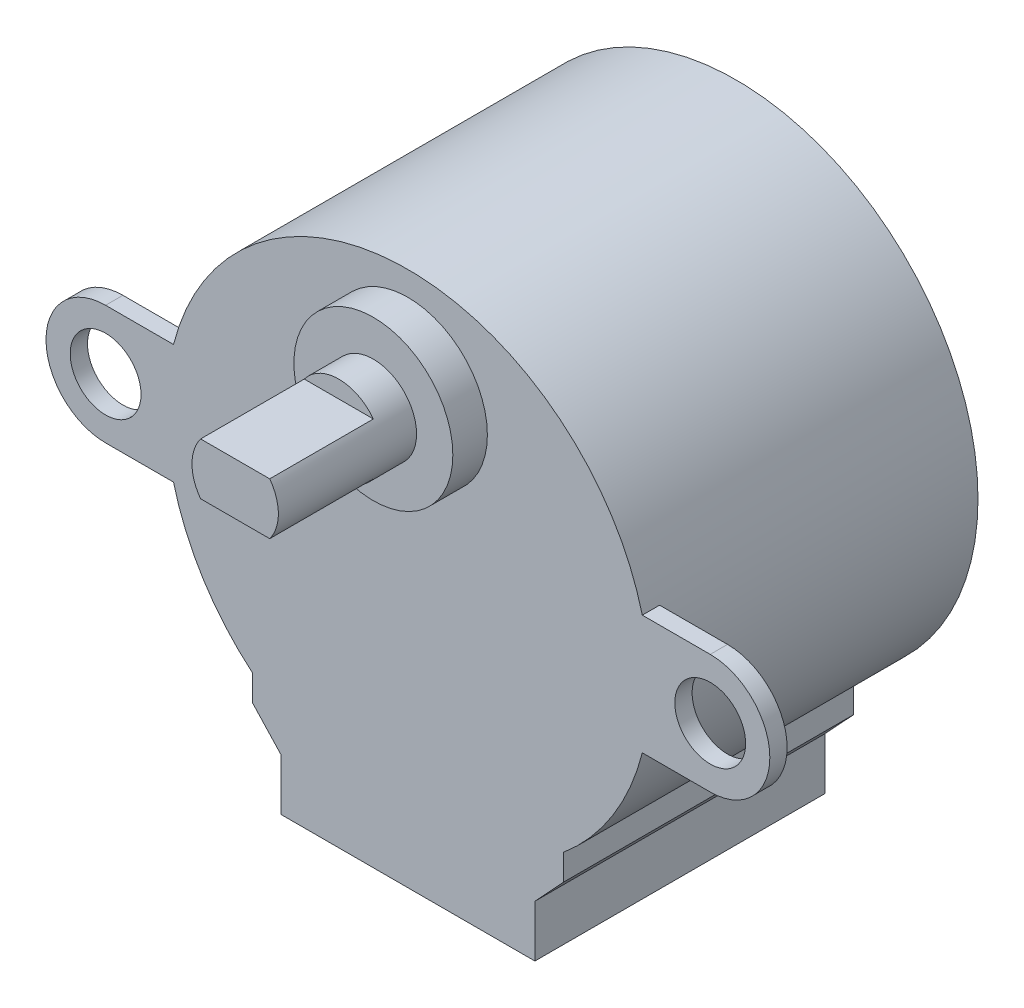
ISO-10303-21;
HEADER;
FILE_DESCRIPTION(('STEP AP214'),'2;1');
FILE_NAME('part.step','',(''),(''),'','','');
FILE_SCHEMA(('AUTOMOTIVE_DESIGN { 1 0 10303 214 1 1 1 1 }'));
ENDSEC;
DATA;
#1=APPLICATION_CONTEXT('core data for automotive mechanical design processes');
#2=APPLICATION_PROTOCOL_DEFINITION('international standard','automotive_design',2000,#1);
#3=PRODUCT_CONTEXT('',#1,'mechanical');
#4=PRODUCT('Part','Part','',(#3));
#5=PRODUCT_RELATED_PRODUCT_CATEGORY('part','',(#4));
#6=PRODUCT_DEFINITION_FORMATION('','',#4);
#7=PRODUCT_DEFINITION_CONTEXT('part definition',#1,'design');
#8=PRODUCT_DEFINITION('design','',#6,#7);
#9=PRODUCT_DEFINITION_SHAPE('','',#8);
#10=(LENGTH_UNIT() NAMED_UNIT(*) SI_UNIT(.MILLI.,.METRE.));
#11=(NAMED_UNIT(*) PLANE_ANGLE_UNIT() SI_UNIT($,.RADIAN.));
#12=(NAMED_UNIT(*) SI_UNIT($,.STERADIAN.) SOLID_ANGLE_UNIT());
#13=UNCERTAINTY_MEASURE_WITH_UNIT(LENGTH_MEASURE(1.E-05),#10,'distance_accuracy_value','');
#14=(GEOMETRIC_REPRESENTATION_CONTEXT(3) GLOBAL_UNCERTAINTY_ASSIGNED_CONTEXT((#13)) GLOBAL_UNIT_ASSIGNED_CONTEXT((#10,
#11,#12)) REPRESENTATION_CONTEXT('',''));
#15=CARTESIAN_POINT('',(0.,0.,0.));
#16=DIRECTION('',(0.,0.,1.));
#17=DIRECTION('',(1.,0.,0.));
#18=AXIS2_PLACEMENT_3D('',#15,#16,#17);
#19=CARTESIAN_POINT('',(0.,8.,29.));
#20=DIRECTION('',(0.,0.,-1.));
#21=DIRECTION('',(-1.,0.,0.));
#22=AXIS2_PLACEMENT_3D('',#19,#20,#21);
#23=CYLINDRICAL_SURFACE('',#22,2.5);
#24=CARTESIAN_POINT('',(0.,8.,29.));
#25=DIRECTION('',(0.,0.,1.));
#26=DIRECTION('',(1.,0.,0.));
#27=AXIS2_PLACEMENT_3D('',#24,#25,#26);
#28=CIRCLE('',#27,2.5);
#29=CARTESIAN_POINT('',(-2.,9.5,29.));
#30=VERTEX_POINT('',#29);
#31=CARTESIAN_POINT('',(-2.,6.5,29.));
#32=VERTEX_POINT('',#31);
#33=EDGE_CURVE('E219',#30,#32,#28,.T.);
#34=ORIENTED_EDGE('',*,*,#33,.F.);
#35=DIRECTION('',(0.,0.,1.));
#36=VECTOR('',#35,1.);
#37=CARTESIAN_POINT('',(-2.,9.5,23.));
#38=LINE('',#37,#36);
#39=CARTESIAN_POINT('',(-2.,9.5,23.));
#40=VERTEX_POINT('',#39);
#41=EDGE_CURVE('E66',#40,#30,#38,.T.);
#42=ORIENTED_EDGE('',*,*,#41,.F.);
#43=CARTESIAN_POINT('',(0.,8.,23.));
#44=DIRECTION('',(0.,0.,1.));
#45=DIRECTION('',(1.,0.,0.));
#46=AXIS2_PLACEMENT_3D('',#43,#44,#45);
#47=CIRCLE('',#46,2.5);
#48=CARTESIAN_POINT('',(2.,9.5,23.));
#49=VERTEX_POINT('',#48);
#50=EDGE_CURVE('E205',#49,#40,#47,.T.);
#51=ORIENTED_EDGE('',*,*,#50,.F.);
#52=DIRECTION('',(0.,0.,1.));
#53=VECTOR('',#52,1.);
#54=CARTESIAN_POINT('',(2.,9.5,23.));
#55=LINE('',#54,#53);
#56=CARTESIAN_POINT('',(2.,9.5,29.));
#57=VERTEX_POINT('',#56);
#58=EDGE_CURVE('E213',#49,#57,#55,.T.);
#59=ORIENTED_EDGE('',*,*,#58,.T.);
#60=CARTESIAN_POINT('',(2.,6.5,29.));
#61=VERTEX_POINT('',#60);
#62=EDGE_CURVE('E221',#61,#57,#28,.T.);
#63=ORIENTED_EDGE('',*,*,#62,.F.);
#64=DIRECTION('',(0.,0.,1.));
#65=VECTOR('',#64,1.);
#66=CARTESIAN_POINT('',(2.,6.5,23.));
#67=LINE('',#66,#65);
#68=CARTESIAN_POINT('',(2.,6.5,23.));
#69=VERTEX_POINT('',#68);
#70=EDGE_CURVE('E58',#69,#61,#67,.T.);
#71=ORIENTED_EDGE('',*,*,#70,.F.);
#72=CARTESIAN_POINT('',(0.,8.,23.));
#73=DIRECTION('',(0.,0.,1.));
#74=DIRECTION('',(1.,0.,0.));
#75=AXIS2_PLACEMENT_3D('',#72,#73,#74);
#76=CIRCLE('',#75,2.5);
#77=CARTESIAN_POINT('',(-2.,6.5,23.));
#78=VERTEX_POINT('',#77);
#79=EDGE_CURVE('E227',#78,#69,#76,.T.);
#80=ORIENTED_EDGE('',*,*,#79,.F.);
#81=DIRECTION('',(0.,0.,1.));
#82=VECTOR('',#81,1.);
#83=CARTESIAN_POINT('',(-2.,6.5,23.));
#84=LINE('',#83,#82);
#85=EDGE_CURVE('E231',#78,#32,#84,.T.);
#86=ORIENTED_EDGE('',*,*,#85,.T.);
#87=EDGE_LOOP('',(#34,#42,#51,#59,#63,#71,#80,#86));
#88=FACE_BOUND('',#87,.T.);
#89=CARTESIAN_POINT('',(0.,8.,21.));
#90=DIRECTION('',(0.,0.,1.));
#91=DIRECTION('',(1.,0.,0.));
#92=AXIS2_PLACEMENT_3D('',#89,#90,#91);
#93=CIRCLE('',#92,2.5);
#94=CARTESIAN_POINT('',(2.5,8.,21.));
#95=VERTEX_POINT('',#94);
#96=EDGE_CURVE('E11',#95,#95,#93,.T.);
#97=ORIENTED_EDGE('',*,*,#96,.T.);
#98=EDGE_LOOP('',(#97));
#99=FACE_BOUND('',#98,.T.);
#100=ADVANCED_FACE('F41',(#88,#99),#23,.T.);
#101=CARTESIAN_POINT('',(0.,8.,29.));
#102=DIRECTION('',(0.,0.,1.));
#103=DIRECTION('',(1.,0.,0.));
#104=AXIS2_PLACEMENT_3D('',#101,#102,#103);
#105=PLANE('',#104);
#106=DIRECTION('',(1.,0.,0.));
#107=VECTOR('',#106,1.);
#108=CARTESIAN_POINT('',(0.,9.5,29.));
#109=LINE('',#108,#107);
#110=EDGE_CURVE('E210',#30,#57,#109,.T.);
#111=ORIENTED_EDGE('',*,*,#110,.F.);
#112=ORIENTED_EDGE('',*,*,#33,.T.);
#113=DIRECTION('',(1.,0.,0.));
#114=VECTOR('',#113,1.);
#115=CARTESIAN_POINT('',(0.,6.5,29.));
#116=LINE('',#115,#114);
#117=EDGE_CURVE('E228',#32,#61,#116,.T.);
#118=ORIENTED_EDGE('',*,*,#117,.T.);
#119=ORIENTED_EDGE('',*,*,#62,.T.);
#120=EDGE_LOOP('',(#111,#112,#118,#119));
#121=FACE_BOUND('',#120,.T.);
#122=ADVANCED_FACE('F429',(#121),#105,.T.);
#123=CARTESIAN_POINT('',(0.,0.,19.));
#124=DIRECTION('',(0.,0.,-1.));
#125=DIRECTION('',(-1.,0.,0.));
#126=AXIS2_PLACEMENT_3D('',#123,#124,#125);
#127=CYLINDRICAL_SURFACE('',#126,14.);
#128=CARTESIAN_POINT('',(0.,0.,19.));
#129=DIRECTION('',(0.,0.,1.));
#130=DIRECTION('',(1.,0.,0.));
#131=AXIS2_PLACEMENT_3D('',#128,#129,#130);
#132=CIRCLE('',#131,14.);
#133=CARTESIAN_POINT('',(13.5682533879641,3.45,19.));
#134=VERTEX_POINT('',#133);
#135=CARTESIAN_POINT('',(-13.5682533879641,3.45,19.));
#136=VERTEX_POINT('',#135);
#137=EDGE_CURVE('E405',#134,#136,#132,.T.);
#138=ORIENTED_EDGE('',*,*,#137,.F.);
#139=DIRECTION('',(0.,0.,1.));
#140=VECTOR('',#139,1.);
#141=CARTESIAN_POINT('',(13.5682533879641,3.45,18.));
#142=LINE('',#141,#140);
#143=CARTESIAN_POINT('',(13.5682533879641,3.45,18.));
#144=VERTEX_POINT('',#143);
#145=EDGE_CURVE('E240',#144,#134,#142,.T.);
#146=ORIENTED_EDGE('',*,*,#145,.F.);
#147=CARTESIAN_POINT('',(0.,0.,18.));
#148=DIRECTION('',(0.,0.,-1.));
#149=DIRECTION('',(-1.,0.,0.));
#150=AXIS2_PLACEMENT_3D('',#147,#148,#149);
#151=CIRCLE('',#150,14.);
#152=CARTESIAN_POINT('',(13.5682533879641,-3.45,18.));
#153=VERTEX_POINT('',#152);
#154=EDGE_CURVE('E257',#144,#153,#151,.T.);
#155=ORIENTED_EDGE('',*,*,#154,.T.);
#156=DIRECTION('',(0.,0.,1.));
#157=VECTOR('',#156,1.);
#158=CARTESIAN_POINT('',(13.5682533879641,-3.45,18.));
#159=LINE('',#158,#157);
#160=CARTESIAN_POINT('',(13.5682533879641,-3.45,19.));
#161=VERTEX_POINT('',#160);
#162=EDGE_CURVE('E244',#153,#161,#159,.T.);
#163=ORIENTED_EDGE('',*,*,#162,.T.);
#164=CARTESIAN_POINT('',(9.,-10.7238052947636,19.));
#165=VERTEX_POINT('',#164);
#166=EDGE_CURVE('E50',#165,#161,#132,.T.);
#167=ORIENTED_EDGE('',*,*,#166,.F.);
#168=DIRECTION('',(0.,0.,1.));
#169=VECTOR('',#168,1.);
#170=CARTESIAN_POINT('',(9.,-10.7238052947636,2.2));
#171=LINE('',#170,#169);
#172=CARTESIAN_POINT('',(9.,-10.7238052947636,2.2));
#173=VERTEX_POINT('',#172);
#174=EDGE_CURVE('E397',#173,#165,#171,.T.);
#175=ORIENTED_EDGE('',*,*,#174,.F.);
#176=CARTESIAN_POINT('',(0.,0.,2.2));
#177=DIRECTION('',(0.,0.,1.));
#178=DIRECTION('',(1.,0.,0.));
#179=AXIS2_PLACEMENT_3D('',#176,#177,#178);
#180=CIRCLE('',#179,14.);
#181=CARTESIAN_POINT('',(-8.99999999999999,-10.7238052947636,2.2));
#182=VERTEX_POINT('',#181);
#183=EDGE_CURVE('E361',#182,#173,#180,.T.);
#184=ORIENTED_EDGE('',*,*,#183,.F.);
#185=DIRECTION('',(0.,0.,1.));
#186=VECTOR('',#185,1.);
#187=CARTESIAN_POINT('',(-8.99999999999999,-10.7238052947636,2.2));
#188=LINE('',#187,#186);
#189=CARTESIAN_POINT('',(-8.99999999999999,-10.7238052947636,19.));
#190=VERTEX_POINT('',#189);
#191=EDGE_CURVE('E394',#182,#190,#188,.T.);
#192=ORIENTED_EDGE('',*,*,#191,.T.);
#193=CARTESIAN_POINT('',(-13.5682533879641,-3.45,19.));
#194=VERTEX_POINT('',#193);
#195=EDGE_CURVE('E406',#194,#190,#132,.T.);
#196=ORIENTED_EDGE('',*,*,#195,.F.);
#197=DIRECTION('',(0.,0.,1.));
#198=VECTOR('',#197,1.);
#199=CARTESIAN_POINT('',(-13.5682533879641,-3.45,18.));
#200=LINE('',#199,#198);
#201=CARTESIAN_POINT('',(-13.5682533879641,-3.45,18.));
#202=VERTEX_POINT('',#201);
#203=EDGE_CURVE('E312',#202,#194,#200,.T.);
#204=ORIENTED_EDGE('',*,*,#203,.F.);
#205=CARTESIAN_POINT('',(0.,0.,18.));
#206=DIRECTION('',(0.,0.,-1.));
#207=DIRECTION('',(1.,0.,0.));
#208=AXIS2_PLACEMENT_3D('',#205,#206,#207);
#209=CIRCLE('',#208,14.);
#210=CARTESIAN_POINT('',(-13.5682533879641,3.45,18.));
#211=VERTEX_POINT('',#210);
#212=EDGE_CURVE('E293',#202,#211,#209,.T.);
#213=ORIENTED_EDGE('',*,*,#212,.T.);
#214=DIRECTION('',(0.,0.,1.));
#215=VECTOR('',#214,1.);
#216=CARTESIAN_POINT('',(-13.5682533879641,3.45,18.));
#217=LINE('',#216,#215);
#218=EDGE_CURVE('E309',#211,#136,#217,.T.);
#219=ORIENTED_EDGE('',*,*,#218,.T.);
#220=EDGE_LOOP('',(#138,#146,#155,#163,#167,#175,#184,#192,#196,#204,#213,#219));
#221=FACE_BOUND('',#220,.T.);
#222=CARTESIAN_POINT('',(0.,0.,0.));
#223=DIRECTION('',(0.,0.,1.));
#224=DIRECTION('',(1.,0.,0.));
#225=AXIS2_PLACEMENT_3D('',#222,#223,#224);
#226=CIRCLE('',#225,14.);
#227=CARTESIAN_POINT('',(14.,0.,0.));
#228=VERTEX_POINT('',#227);
#229=EDGE_CURVE('E45',#228,#228,#226,.T.);
#230=ORIENTED_EDGE('',*,*,#229,.T.);
#231=EDGE_LOOP('',(#230));
#232=FACE_BOUND('',#231,.T.);
#233=ADVANCED_FACE('F43',(#221,#232),#127,.T.);
#234=CARTESIAN_POINT('',(0.,0.,19.));
#235=DIRECTION('',(0.,0.,1.));
#236=DIRECTION('',(1.,0.,0.));
#237=AXIS2_PLACEMENT_3D('',#234,#235,#236);
#238=PLANE('',#237);
#239=CARTESIAN_POINT('',(0.,8.,19.));
#240=DIRECTION('',(0.,0.,1.));
#241=DIRECTION('',(1.,0.,0.));
#242=AXIS2_PLACEMENT_3D('',#239,#240,#241);
#243=CIRCLE('',#242,4.6);
#244=CARTESIAN_POINT('',(4.6,8.,19.));
#245=VERTEX_POINT('',#244);
#246=EDGE_CURVE('E241',#245,#245,#243,.T.);
#247=ORIENTED_EDGE('',*,*,#246,.F.);
#248=EDGE_LOOP('',(#247));
#249=FACE_BOUND('',#248,.T.);
#250=ORIENTED_EDGE('',*,*,#166,.T.);
#251=DIRECTION('',(1.,0.,0.));
#252=VECTOR('',#251,1.);
#253=CARTESIAN_POINT('',(17.5,-3.45,19.));
#254=LINE('',#253,#252);
#255=CARTESIAN_POINT('',(17.5,-3.45,19.));
#256=VERTEX_POINT('',#255);
#257=EDGE_CURVE('E260',#161,#256,#254,.T.);
#258=ORIENTED_EDGE('',*,*,#257,.T.);
#259=CARTESIAN_POINT('',(17.5,0.,19.));
#260=DIRECTION('',(0.,0.,1.));
#261=DIRECTION('',(-1.,0.,0.));
#262=AXIS2_PLACEMENT_3D('',#259,#260,#261);
#263=CIRCLE('',#262,3.45);
#264=CARTESIAN_POINT('',(17.5,3.45,19.));
#265=VERTEX_POINT('',#264);
#266=EDGE_CURVE('E256',#256,#265,#263,.T.);
#267=ORIENTED_EDGE('',*,*,#266,.T.);
#268=DIRECTION('',(-1.,0.,0.));
#269=VECTOR('',#268,1.);
#270=CARTESIAN_POINT('',(17.5,3.45,19.));
#271=LINE('',#270,#269);
#272=EDGE_CURVE('E254',#265,#134,#271,.T.);
#273=ORIENTED_EDGE('',*,*,#272,.T.);
#274=ORIENTED_EDGE('',*,*,#137,.T.);
#275=DIRECTION('',(-1.,0.,0.));
#276=VECTOR('',#275,1.);
#277=CARTESIAN_POINT('',(-17.5,3.45,19.));
#278=LINE('',#277,#276);
#279=CARTESIAN_POINT('',(-17.5,3.45,19.));
#280=VERTEX_POINT('',#279);
#281=EDGE_CURVE('E290',#136,#280,#278,.T.);
#282=ORIENTED_EDGE('',*,*,#281,.T.);
#283=CARTESIAN_POINT('',(-17.5,0.,19.));
#284=DIRECTION('',(0.,0.,1.));
#285=DIRECTION('',(1.,0.,0.));
#286=AXIS2_PLACEMENT_3D('',#283,#284,#285);
#287=CIRCLE('',#286,3.45);
#288=CARTESIAN_POINT('',(-17.5,-3.45,19.));
#289=VERTEX_POINT('',#288);
#290=EDGE_CURVE('E283',#280,#289,#287,.T.);
#291=ORIENTED_EDGE('',*,*,#290,.T.);
#292=DIRECTION('',(1.,0.,0.));
#293=VECTOR('',#292,1.);
#294=CARTESIAN_POINT('',(-17.5,-3.45,19.));
#295=LINE('',#294,#293);
#296=EDGE_CURVE('E302',#289,#194,#295,.T.);
#297=ORIENTED_EDGE('',*,*,#296,.T.);
#298=ORIENTED_EDGE('',*,*,#195,.T.);
#299=DIRECTION('',(0.,1.,0.));
#300=VECTOR('',#299,1.);
#301=CARTESIAN_POINT('',(-9.,-12.2238052947636,19.));
#302=LINE('',#301,#300);
#303=CARTESIAN_POINT('',(-9.,-12.2238052947636,19.));
#304=VERTEX_POINT('',#303);
#305=EDGE_CURVE('E380',#304,#190,#302,.T.);
#306=ORIENTED_EDGE('',*,*,#305,.F.);
#307=DIRECTION('',(-0.68060089492241,0.732654367236567,0.));
#308=VECTOR('',#307,1.);
#309=CARTESIAN_POINT('',(-7.35,-14.,19.));
#310=LINE('',#309,#308);
#311=CARTESIAN_POINT('',(-7.35,-14.,19.));
#312=VERTEX_POINT('',#311);
#313=EDGE_CURVE('E383',#312,#304,#310,.T.);
#314=ORIENTED_EDGE('',*,*,#313,.F.);
#315=DIRECTION('',(0.,1.,0.));
#316=VECTOR('',#315,1.);
#317=CARTESIAN_POINT('',(-7.35,-17.,19.));
#318=LINE('',#317,#316);
#319=CARTESIAN_POINT('',(-7.35,-17.,19.));
#320=VERTEX_POINT('',#319);
#321=EDGE_CURVE('E352',#320,#312,#318,.T.);
#322=ORIENTED_EDGE('',*,*,#321,.F.);
#323=DIRECTION('',(1.,0.,0.));
#324=VECTOR('',#323,1.);
#325=CARTESIAN_POINT('',(-7.35,-17.,19.));
#326=LINE('',#325,#324);
#327=CARTESIAN_POINT('',(7.35,-17.,19.));
#328=VERTEX_POINT('',#327);
#329=EDGE_CURVE('E341',#320,#328,#326,.T.);
#330=ORIENTED_EDGE('',*,*,#329,.T.);
#331=DIRECTION('',(0.,1.,0.));
#332=VECTOR('',#331,1.);
#333=CARTESIAN_POINT('',(7.35,-17.,19.));
#334=LINE('',#333,#332);
#335=CARTESIAN_POINT('',(7.35,-14.,19.));
#336=VERTEX_POINT('',#335);
#337=EDGE_CURVE('E372',#328,#336,#334,.T.);
#338=ORIENTED_EDGE('',*,*,#337,.T.);
#339=DIRECTION('',(0.68060089492241,0.732654367236567,0.));
#340=VECTOR('',#339,1.);
#341=CARTESIAN_POINT('',(7.35,-14.,19.));
#342=LINE('',#341,#340);
#343=CARTESIAN_POINT('',(9.,-12.2238052947636,19.));
#344=VERTEX_POINT('',#343);
#345=EDGE_CURVE('E375',#336,#344,#342,.T.);
#346=ORIENTED_EDGE('',*,*,#345,.T.);
#347=DIRECTION('',(0.,1.,0.));
#348=VECTOR('',#347,1.);
#349=CARTESIAN_POINT('',(9.,-12.2238052947636,19.));
#350=LINE('',#349,#348);
#351=EDGE_CURVE('E378',#344,#165,#350,.T.);
#352=ORIENTED_EDGE('',*,*,#351,.T.);
#353=EDGE_LOOP('',(#250,#258,#267,#273,#274,#282,#291,#297,#298,#306,#314,#322,#330,#338,#346,#352));
#354=FACE_BOUND('',#353,.T.);
#355=CARTESIAN_POINT('',(-17.5,0.,19.));
#356=DIRECTION('',(0.,0.,1.));
#357=DIRECTION('',(1.,0.,0.));
#358=AXIS2_PLACEMENT_3D('',#355,#356,#357);
#359=CIRCLE('',#358,2.05);
#360=CARTESIAN_POINT('',(-15.45,0.,19.));
#361=VERTEX_POINT('',#360);
#362=EDGE_CURVE('E277',#361,#361,#359,.T.);
#363=ORIENTED_EDGE('',*,*,#362,.F.);
#364=EDGE_LOOP('',(#363));
#365=FACE_BOUND('',#364,.T.);
#366=CARTESIAN_POINT('',(17.5,0.,19.));
#367=DIRECTION('',(0.,0.,1.));
#368=DIRECTION('',(-1.,0.,0.));
#369=AXIS2_PLACEMENT_3D('',#366,#367,#368);
#370=CIRCLE('',#369,2.05);
#371=CARTESIAN_POINT('',(15.45,0.,19.));
#372=VERTEX_POINT('',#371);
#373=EDGE_CURVE('E274',#372,#372,#370,.T.);
#374=ORIENTED_EDGE('',*,*,#373,.F.);
#375=EDGE_LOOP('',(#374));
#376=FACE_BOUND('',#375,.T.);
#377=ADVANCED_FACE('F418',(#249,#354,#365,#376),#238,.T.);
#378=CARTESIAN_POINT('',(0.,0.,0.));
#379=DIRECTION('',(0.,0.,1.));
#380=DIRECTION('',(1.,0.,0.));
#381=AXIS2_PLACEMENT_3D('',#378,#379,#380);
#382=PLANE('',#381);
#383=ORIENTED_EDGE('',*,*,#229,.F.);
#384=EDGE_LOOP('',(#383));
#385=FACE_BOUND('',#384,.T.);
#386=ADVANCED_FACE('F415',(#385),#382,.F.);
#387=CARTESIAN_POINT('',(-7.35,-17.,2.2));
#388=DIRECTION('',(0.,-1.,0.));
#389=DIRECTION('',(0.,0.,-1.));
#390=AXIS2_PLACEMENT_3D('',#387,#388,#389);
#391=PLANE('',#390);
#392=CARTESIAN_POINT('',(-3.,-17.,17.25));
#393=DIRECTION('',(0.,-1.,0.));
#394=DIRECTION('',(0.,0.,-1.));
#395=AXIS2_PLACEMENT_3D('',#392,#393,#394);
#396=CIRCLE('',#395,0.499999999999997);
#397=CARTESIAN_POINT('',(-3.,-17.,17.75));
#398=VERTEX_POINT('',#397);
#399=CARTESIAN_POINT('',(-3.,-17.,16.75));
#400=VERTEX_POINT('',#399);
#401=EDGE_CURVE('E308',#398,#400,#396,.T.);
#402=ORIENTED_EDGE('',*,*,#401,.F.);
#403=DIRECTION('',(-1.,0.,0.));
#404=VECTOR('',#403,1.);
#405=CARTESIAN_POINT('',(-3.,-17.,17.75));
#406=LINE('',#405,#404);
#407=CARTESIAN_POINT('',(3.,-17.,17.75));
#408=VERTEX_POINT('',#407);
#409=EDGE_CURVE('E320',#408,#398,#406,.T.);
#410=ORIENTED_EDGE('',*,*,#409,.F.);
#411=CARTESIAN_POINT('',(3.,-17.,17.25));
#412=DIRECTION('',(0.,-1.,0.));
#413=DIRECTION('',(0.,0.,-1.));
#414=AXIS2_PLACEMENT_3D('',#411,#412,#413);
#415=CIRCLE('',#414,0.499999999999997);
#416=CARTESIAN_POINT('',(3.,-17.,16.75));
#417=VERTEX_POINT('',#416);
#418=EDGE_CURVE('E334',#417,#408,#415,.T.);
#419=ORIENTED_EDGE('',*,*,#418,.F.);
#420=DIRECTION('',(1.,0.,0.));
#421=VECTOR('',#420,1.);
#422=CARTESIAN_POINT('',(-3.,-17.,16.75));
#423=LINE('',#422,#421);
#424=EDGE_CURVE('E331',#400,#417,#423,.T.);
#425=ORIENTED_EDGE('',*,*,#424,.F.);
#426=EDGE_LOOP('',(#402,#410,#419,#425));
#427=FACE_BOUND('',#426,.T.);
#428=ORIENTED_EDGE('',*,*,#329,.F.);
#429=DIRECTION('',(0.,0.,1.));
#430=VECTOR('',#429,1.);
#431=CARTESIAN_POINT('',(-7.35,-17.,2.2));
#432=LINE('',#431,#430);
#433=CARTESIAN_POINT('',(-7.35,-17.,2.2));
#434=VERTEX_POINT('',#433);
#435=EDGE_CURVE('E386',#434,#320,#432,.T.);
#436=ORIENTED_EDGE('',*,*,#435,.F.);
#437=DIRECTION('',(1.,0.,0.));
#438=VECTOR('',#437,1.);
#439=CARTESIAN_POINT('',(-7.35,-17.,2.2));
#440=LINE('',#439,#438);
#441=CARTESIAN_POINT('',(7.35,-17.,2.2));
#442=VERTEX_POINT('',#441);
#443=EDGE_CURVE('E348',#434,#442,#440,.T.);
#444=ORIENTED_EDGE('',*,*,#443,.T.);
#445=DIRECTION('',(0.,0.,1.));
#446=VECTOR('',#445,1.);
#447=CARTESIAN_POINT('',(7.35,-17.,2.2));
#448=LINE('',#447,#446);
#449=EDGE_CURVE('E369',#442,#328,#448,.T.);
#450=ORIENTED_EDGE('',*,*,#449,.T.);
#451=EDGE_LOOP('',(#428,#436,#444,#450));
#452=FACE_BOUND('',#451,.T.);
#453=ADVANCED_FACE('F417',(#427,#452),#391,.T.);
#454=CARTESIAN_POINT('',(-7.35,-17.,2.2));
#455=DIRECTION('',(1.,0.,0.));
#456=DIRECTION('',(0.,0.,-1.));
#457=AXIS2_PLACEMENT_3D('',#454,#455,#456);
#458=PLANE('',#457);
#459=ORIENTED_EDGE('',*,*,#321,.T.);
#460=DIRECTION('',(0.,0.,1.));
#461=VECTOR('',#460,1.);
#462=CARTESIAN_POINT('',(-7.35,-14.,2.2));
#463=LINE('',#462,#461);
#464=CARTESIAN_POINT('',(-7.35,-14.,2.2));
#465=VERTEX_POINT('',#464);
#466=EDGE_CURVE('E388',#465,#312,#463,.T.);
#467=ORIENTED_EDGE('',*,*,#466,.F.);
#468=DIRECTION('',(0.,1.,0.));
#469=VECTOR('',#468,1.);
#470=CARTESIAN_POINT('',(-7.35,-17.,2.2));
#471=LINE('',#470,#469);
#472=EDGE_CURVE('E367',#434,#465,#471,.T.);
#473=ORIENTED_EDGE('',*,*,#472,.F.);
#474=ORIENTED_EDGE('',*,*,#435,.T.);
#475=EDGE_LOOP('',(#459,#467,#473,#474));
#476=FACE_BOUND('',#475,.T.);
#477=ADVANCED_FACE('F423',(#476),#458,.F.);
#478=CARTESIAN_POINT('',(-7.35,-14.,2.2));
#479=DIRECTION('',(0.732654367236567,0.68060089492241,0.));
#480=DIRECTION('',(-0.68060089492241,0.732654367236567,0.));
#481=AXIS2_PLACEMENT_3D('',#478,#479,#480);
#482=PLANE('',#481);
#483=ORIENTED_EDGE('',*,*,#313,.T.);
#484=DIRECTION('',(0.,0.,1.));
#485=VECTOR('',#484,1.);
#486=CARTESIAN_POINT('',(-9.,-12.2238052947636,2.2));
#487=LINE('',#486,#485);
#488=CARTESIAN_POINT('',(-9.,-12.2238052947636,2.2));
#489=VERTEX_POINT('',#488);
#490=EDGE_CURVE('E391',#489,#304,#487,.T.);
#491=ORIENTED_EDGE('',*,*,#490,.F.);
#492=DIRECTION('',(-0.68060089492241,0.732654367236567,0.));
#493=VECTOR('',#492,1.);
#494=CARTESIAN_POINT('',(-7.35,-14.,2.2));
#495=LINE('',#494,#493);
#496=EDGE_CURVE('E365',#465,#489,#495,.T.);
#497=ORIENTED_EDGE('',*,*,#496,.F.);
#498=ORIENTED_EDGE('',*,*,#466,.T.);
#499=EDGE_LOOP('',(#483,#491,#497,#498));
#500=FACE_BOUND('',#499,.T.);
#501=ADVANCED_FACE('F514',(#500),#482,.F.);
#502=CARTESIAN_POINT('',(-9.,-12.2238052947636,2.2));
#503=DIRECTION('',(1.,0.,0.));
#504=DIRECTION('',(0.,0.,-1.));
#505=AXIS2_PLACEMENT_3D('',#502,#503,#504);
#506=PLANE('',#505);
#507=ORIENTED_EDGE('',*,*,#305,.T.);
#508=ORIENTED_EDGE('',*,*,#191,.F.);
#509=DIRECTION('',(0.,1.,0.));
#510=VECTOR('',#509,1.);
#511=CARTESIAN_POINT('',(-9.,-12.2238052947636,2.2));
#512=LINE('',#511,#510);
#513=EDGE_CURVE('E363',#489,#182,#512,.T.);
#514=ORIENTED_EDGE('',*,*,#513,.F.);
#515=ORIENTED_EDGE('',*,*,#490,.T.);
#516=EDGE_LOOP('',(#507,#508,#514,#515));
#517=FACE_BOUND('',#516,.T.);
#518=ADVANCED_FACE('F518',(#517),#506,.F.);
#519=CARTESIAN_POINT('',(9.,-12.2238052947636,2.2));
#520=DIRECTION('',(1.,0.,0.));
#521=DIRECTION('',(0.,0.,-1.));
#522=AXIS2_PLACEMENT_3D('',#519,#520,#521);
#523=PLANE('',#522);
#524=ORIENTED_EDGE('',*,*,#351,.F.);
#525=DIRECTION('',(0.,0.,1.));
#526=VECTOR('',#525,1.);
#527=CARTESIAN_POINT('',(9.,-12.2238052947636,2.2));
#528=LINE('',#527,#526);
#529=CARTESIAN_POINT('',(9.,-12.2238052947636,2.2));
#530=VERTEX_POINT('',#529);
#531=EDGE_CURVE('E400',#530,#344,#528,.T.);
#532=ORIENTED_EDGE('',*,*,#531,.F.);
#533=DIRECTION('',(0.,1.,0.));
#534=VECTOR('',#533,1.);
#535=CARTESIAN_POINT('',(9.,-12.2238052947636,2.2));
#536=LINE('',#535,#534);
#537=EDGE_CURVE('E358',#530,#173,#536,.T.);
#538=ORIENTED_EDGE('',*,*,#537,.T.);
#539=ORIENTED_EDGE('',*,*,#174,.T.);
#540=EDGE_LOOP('',(#524,#532,#538,#539));
#541=FACE_BOUND('',#540,.T.);
#542=ADVANCED_FACE('F522',(#541),#523,.T.);
#543=CARTESIAN_POINT('',(7.35,-14.,2.2));
#544=DIRECTION('',(0.732654367236567,-0.68060089492241,0.));
#545=DIRECTION('',(0.68060089492241,0.732654367236567,0.));
#546=AXIS2_PLACEMENT_3D('',#543,#544,#545);
#547=PLANE('',#546);
#548=ORIENTED_EDGE('',*,*,#345,.F.);
#549=DIRECTION('',(0.,0.,1.));
#550=VECTOR('',#549,1.);
#551=CARTESIAN_POINT('',(7.35,-14.,2.2));
#552=LINE('',#551,#550);
#553=CARTESIAN_POINT('',(7.35,-14.,2.2));
#554=VERTEX_POINT('',#553);
#555=EDGE_CURVE('E402',#554,#336,#552,.T.);
#556=ORIENTED_EDGE('',*,*,#555,.F.);
#557=DIRECTION('',(0.68060089492241,0.732654367236567,0.));
#558=VECTOR('',#557,1.);
#559=CARTESIAN_POINT('',(7.35,-14.,2.2));
#560=LINE('',#559,#558);
#561=EDGE_CURVE('E355',#554,#530,#560,.T.);
#562=ORIENTED_EDGE('',*,*,#561,.T.);
#563=ORIENTED_EDGE('',*,*,#531,.T.);
#564=EDGE_LOOP('',(#548,#556,#562,#563));
#565=FACE_BOUND('',#564,.T.);
#566=ADVANCED_FACE('F526',(#565),#547,.T.);
#567=CARTESIAN_POINT('',(7.35,-17.,2.2));
#568=DIRECTION('',(1.,0.,0.));
#569=DIRECTION('',(0.,0.,-1.));
#570=AXIS2_PLACEMENT_3D('',#567,#568,#569);
#571=PLANE('',#570);
#572=ORIENTED_EDGE('',*,*,#337,.F.);
#573=ORIENTED_EDGE('',*,*,#449,.F.);
#574=DIRECTION('',(0.,1.,0.));
#575=VECTOR('',#574,1.);
#576=CARTESIAN_POINT('',(7.35,-17.,2.2));
#577=LINE('',#576,#575);
#578=EDGE_CURVE('E351',#442,#554,#577,.T.);
#579=ORIENTED_EDGE('',*,*,#578,.T.);
#580=ORIENTED_EDGE('',*,*,#555,.T.);
#581=EDGE_LOOP('',(#572,#573,#579,#580));
#582=FACE_BOUND('',#581,.T.);
#583=ADVANCED_FACE('F510',(#582),#571,.T.);
#584=CARTESIAN_POINT('',(0.,0.,2.2));
#585=DIRECTION('',(0.,0.,1.));
#586=DIRECTION('',(1.,0.,0.));
#587=AXIS2_PLACEMENT_3D('',#584,#585,#586);
#588=PLANE('',#587);
#589=ORIENTED_EDGE('',*,*,#443,.F.);
#590=ORIENTED_EDGE('',*,*,#472,.T.);
#591=ORIENTED_EDGE('',*,*,#496,.T.);
#592=ORIENTED_EDGE('',*,*,#513,.T.);
#593=ORIENTED_EDGE('',*,*,#183,.T.);
#594=ORIENTED_EDGE('',*,*,#537,.F.);
#595=ORIENTED_EDGE('',*,*,#561,.F.);
#596=ORIENTED_EDGE('',*,*,#578,.F.);
#597=EDGE_LOOP('',(#589,#590,#591,#592,#593,#594,#595,#596));
#598=FACE_BOUND('',#597,.T.);
#599=ADVANCED_FACE('F506',(#598),#588,.F.);
#600=CARTESIAN_POINT('',(-3.,-15.,17.25));
#601=DIRECTION('',(0.,-1.,0.));
#602=DIRECTION('',(0.,0.,-1.));
#603=AXIS2_PLACEMENT_3D('',#600,#601,#602);
#604=CYLINDRICAL_SURFACE('',#603,0.499999999999997);
#605=ORIENTED_EDGE('',*,*,#401,.T.);
#606=DIRECTION('',(0.,-1.,0.));
#607=VECTOR('',#606,1.);
#608=CARTESIAN_POINT('',(-3.,-15.,16.75));
#609=LINE('',#608,#607);
#610=CARTESIAN_POINT('',(-3.,-15.,16.75));
#611=VERTEX_POINT('',#610);
#612=EDGE_CURVE('E329',#611,#400,#609,.T.);
#613=ORIENTED_EDGE('',*,*,#612,.F.);
#614=CARTESIAN_POINT('',(-3.,-15.,17.25));
#615=DIRECTION('',(0.,-1.,0.));
#616=DIRECTION('',(0.,0.,-1.));
#617=AXIS2_PLACEMENT_3D('',#614,#615,#616);
#618=CIRCLE('',#617,0.499999999999997);
#619=CARTESIAN_POINT('',(-3.,-15.,17.75));
#620=VERTEX_POINT('',#619);
#621=EDGE_CURVE('E316',#620,#611,#618,.T.);
#622=ORIENTED_EDGE('',*,*,#621,.F.);
#623=DIRECTION('',(0.,-1.,0.));
#624=VECTOR('',#623,1.);
#625=CARTESIAN_POINT('',(-3.,-15.,17.75));
#626=LINE('',#625,#624);
#627=EDGE_CURVE('E339',#620,#398,#626,.T.);
#628=ORIENTED_EDGE('',*,*,#627,.T.);
#629=EDGE_LOOP('',(#605,#613,#622,#628));
#630=FACE_BOUND('',#629,.T.);
#631=ADVANCED_FACE('F496',(#630),#604,.F.);
#632=CARTESIAN_POINT('',(-3.,-15.,17.75));
#633=DIRECTION('',(0.,0.,1.));
#634=DIRECTION('',(1.,0.,0.));
#635=AXIS2_PLACEMENT_3D('',#632,#633,#634);
#636=PLANE('',#635);
#637=ORIENTED_EDGE('',*,*,#409,.T.);
#638=ORIENTED_EDGE('',*,*,#627,.F.);
#639=DIRECTION('',(-1.,0.,0.));
#640=VECTOR('',#639,1.);
#641=CARTESIAN_POINT('',(-3.,-15.,17.75));
#642=LINE('',#641,#640);
#643=CARTESIAN_POINT('',(3.,-15.,17.75));
#644=VERTEX_POINT('',#643);
#645=EDGE_CURVE('E326',#644,#620,#642,.T.);
#646=ORIENTED_EDGE('',*,*,#645,.F.);
#647=DIRECTION('',(0.,-1.,0.));
#648=VECTOR('',#647,1.);
#649=CARTESIAN_POINT('',(3.,-15.,17.75));
#650=LINE('',#649,#648);
#651=EDGE_CURVE('E342',#644,#408,#650,.T.);
#652=ORIENTED_EDGE('',*,*,#651,.T.);
#653=EDGE_LOOP('',(#637,#638,#646,#652));
#654=FACE_BOUND('',#653,.T.);
#655=ADVANCED_FACE('F492',(#654),#636,.F.);
#656=CARTESIAN_POINT('',(3.,-15.,17.25));
#657=DIRECTION('',(0.,-1.,0.));
#658=DIRECTION('',(0.,0.,-1.));
#659=AXIS2_PLACEMENT_3D('',#656,#657,#658);
#660=CYLINDRICAL_SURFACE('',#659,0.499999999999997);
#661=ORIENTED_EDGE('',*,*,#418,.T.);
#662=ORIENTED_EDGE('',*,*,#651,.F.);
#663=CARTESIAN_POINT('',(3.,-15.,17.25));
#664=DIRECTION('',(0.,-1.,0.));
#665=DIRECTION('',(0.,0.,-1.));
#666=AXIS2_PLACEMENT_3D('',#663,#664,#665);
#667=CIRCLE('',#666,0.499999999999997);
#668=CARTESIAN_POINT('',(3.,-15.,16.75));
#669=VERTEX_POINT('',#668);
#670=EDGE_CURVE('E323',#669,#644,#667,.T.);
#671=ORIENTED_EDGE('',*,*,#670,.F.);
#672=DIRECTION('',(0.,-1.,0.));
#673=VECTOR('',#672,1.);
#674=CARTESIAN_POINT('',(3.,-15.,16.75));
#675=LINE('',#674,#673);
#676=EDGE_CURVE('E344',#669,#417,#675,.T.);
#677=ORIENTED_EDGE('',*,*,#676,.T.);
#678=EDGE_LOOP('',(#661,#662,#671,#677));
#679=FACE_BOUND('',#678,.T.);
#680=ADVANCED_FACE('F495',(#679),#660,.F.);
#681=CARTESIAN_POINT('',(-3.,-15.,16.75));
#682=DIRECTION('',(0.,0.,-1.));
#683=DIRECTION('',(-1.,0.,0.));
#684=AXIS2_PLACEMENT_3D('',#681,#682,#683);
#685=PLANE('',#684);
#686=ORIENTED_EDGE('',*,*,#424,.T.);
#687=ORIENTED_EDGE('',*,*,#676,.F.);
#688=DIRECTION('',(1.,0.,0.));
#689=VECTOR('',#688,1.);
#690=CARTESIAN_POINT('',(-3.,-15.,16.75));
#691=LINE('',#690,#689);
#692=EDGE_CURVE('E319',#611,#669,#691,.T.);
#693=ORIENTED_EDGE('',*,*,#692,.F.);
#694=ORIENTED_EDGE('',*,*,#612,.T.);
#695=EDGE_LOOP('',(#686,#687,#693,#694));
#696=FACE_BOUND('',#695,.T.);
#697=ADVANCED_FACE('F490',(#696),#685,.F.);
#698=CARTESIAN_POINT('',(-3.,-15.,17.25));
#699=DIRECTION('',(0.,-1.,0.));
#700=DIRECTION('',(0.,0.,-1.));
#701=AXIS2_PLACEMENT_3D('',#698,#699,#700);
#702=PLANE('',#701);
#703=ORIENTED_EDGE('',*,*,#621,.T.);
#704=ORIENTED_EDGE('',*,*,#692,.T.);
#705=ORIENTED_EDGE('',*,*,#670,.T.);
#706=ORIENTED_EDGE('',*,*,#645,.T.);
#707=EDGE_LOOP('',(#703,#704,#705,#706));
#708=FACE_BOUND('',#707,.T.);
#709=ADVANCED_FACE('F486',(#708),#702,.T.);
#710=CARTESIAN_POINT('',(-17.5,0.,18.));
#711=DIRECTION('',(0.,0.,1.));
#712=DIRECTION('',(1.,0.,0.));
#713=AXIS2_PLACEMENT_3D('',#710,#711,#712);
#714=CYLINDRICAL_SURFACE('',#713,3.45);
#715=ORIENTED_EDGE('',*,*,#290,.F.);
#716=DIRECTION('',(0.,0.,1.));
#717=VECTOR('',#716,1.);
#718=CARTESIAN_POINT('',(-17.5,3.45,18.));
#719=LINE('',#718,#717);
#720=CARTESIAN_POINT('',(-17.5,3.45,18.));
#721=VERTEX_POINT('',#720);
#722=EDGE_CURVE('E306',#721,#280,#719,.T.);
#723=ORIENTED_EDGE('',*,*,#722,.F.);
#724=CARTESIAN_POINT('',(-17.5,0.,18.));
#725=DIRECTION('',(0.,0.,1.));
#726=DIRECTION('',(1.,0.,0.));
#727=AXIS2_PLACEMENT_3D('',#724,#725,#726);
#728=CIRCLE('',#727,3.45);
#729=CARTESIAN_POINT('',(-17.5,-3.45,18.));
#730=VERTEX_POINT('',#729);
#731=EDGE_CURVE('E286',#721,#730,#728,.T.);
#732=ORIENTED_EDGE('',*,*,#731,.T.);
#733=DIRECTION('',(0.,0.,1.));
#734=VECTOR('',#733,1.);
#735=CARTESIAN_POINT('',(-17.5,-3.45,18.));
#736=LINE('',#735,#734);
#737=EDGE_CURVE('E299',#730,#289,#736,.T.);
#738=ORIENTED_EDGE('',*,*,#737,.T.);
#739=EDGE_LOOP('',(#715,#723,#732,#738));
#740=FACE_BOUND('',#739,.T.);
#741=ADVANCED_FACE('F479',(#740),#714,.T.);
#742=CARTESIAN_POINT('',(-17.5,3.45,18.));
#743=DIRECTION('',(0.,1.,0.));
#744=DIRECTION('',(0.,0.,1.));
#745=AXIS2_PLACEMENT_3D('',#742,#743,#744);
#746=PLANE('',#745);
#747=ORIENTED_EDGE('',*,*,#281,.F.);
#748=ORIENTED_EDGE('',*,*,#218,.F.);
#749=DIRECTION('',(-1.,0.,0.));
#750=VECTOR('',#749,1.);
#751=CARTESIAN_POINT('',(-17.5,3.45,18.));
#752=LINE('',#751,#750);
#753=EDGE_CURVE('E296',#211,#721,#752,.T.);
#754=ORIENTED_EDGE('',*,*,#753,.T.);
#755=ORIENTED_EDGE('',*,*,#722,.T.);
#756=EDGE_LOOP('',(#747,#748,#754,#755));
#757=FACE_BOUND('',#756,.T.);
#758=ADVANCED_FACE('F476',(#757),#746,.T.);
#759=CARTESIAN_POINT('',(-17.5,-3.45,18.));
#760=DIRECTION('',(0.,-1.,0.));
#761=DIRECTION('',(0.,0.,-1.));
#762=AXIS2_PLACEMENT_3D('',#759,#760,#761);
#763=PLANE('',#762);
#764=ORIENTED_EDGE('',*,*,#296,.F.);
#765=ORIENTED_EDGE('',*,*,#737,.F.);
#766=DIRECTION('',(1.,0.,0.));
#767=VECTOR('',#766,1.);
#768=CARTESIAN_POINT('',(-17.5,-3.45,18.));
#769=LINE('',#768,#767);
#770=EDGE_CURVE('E289',#730,#202,#769,.T.);
#771=ORIENTED_EDGE('',*,*,#770,.T.);
#772=ORIENTED_EDGE('',*,*,#203,.T.);
#773=EDGE_LOOP('',(#764,#765,#771,#772));
#774=FACE_BOUND('',#773,.T.);
#775=ADVANCED_FACE('F474',(#774),#763,.T.);
#776=CARTESIAN_POINT('',(-17.5,0.,18.));
#777=DIRECTION('',(0.,0.,1.));
#778=DIRECTION('',(1.,0.,0.));
#779=AXIS2_PLACEMENT_3D('',#776,#777,#778);
#780=PLANE('',#779);
#781=CARTESIAN_POINT('',(-17.5,0.,18.));
#782=DIRECTION('',(0.,0.,1.));
#783=DIRECTION('',(1.,0.,0.));
#784=AXIS2_PLACEMENT_3D('',#781,#782,#783);
#785=CIRCLE('',#784,2.05);
#786=CARTESIAN_POINT('',(-15.45,0.,18.));
#787=VERTEX_POINT('',#786);
#788=EDGE_CURVE('E280',#787,#787,#785,.T.);
#789=ORIENTED_EDGE('',*,*,#788,.T.);
#790=EDGE_LOOP('',(#789));
#791=FACE_BOUND('',#790,.T.);
#792=ORIENTED_EDGE('',*,*,#731,.F.);
#793=ORIENTED_EDGE('',*,*,#753,.F.);
#794=ORIENTED_EDGE('',*,*,#212,.F.);
#795=ORIENTED_EDGE('',*,*,#770,.F.);
#796=EDGE_LOOP('',(#792,#793,#794,#795));
#797=FACE_BOUND('',#796,.T.);
#798=ADVANCED_FACE('F470',(#791,#797),#780,.F.);
#799=CARTESIAN_POINT('',(-17.5,0.,18.));
#800=DIRECTION('',(0.,0.,1.));
#801=DIRECTION('',(1.,0.,0.));
#802=AXIS2_PLACEMENT_3D('',#799,#800,#801);
#803=CYLINDRICAL_SURFACE('',#802,2.05);
#804=ORIENTED_EDGE('',*,*,#788,.F.);
#805=EDGE_LOOP('',(#804));
#806=FACE_BOUND('',#805,.T.);
#807=ORIENTED_EDGE('',*,*,#362,.T.);
#808=EDGE_LOOP('',(#807));
#809=FACE_BOUND('',#808,.T.);
#810=ADVANCED_FACE('F460',(#806,#809),#803,.F.);
#811=CARTESIAN_POINT('',(17.5,3.45,18.));
#812=DIRECTION('',(0.,1.,0.));
#813=DIRECTION('',(0.,0.,1.));
#814=AXIS2_PLACEMENT_3D('',#811,#812,#813);
#815=PLANE('',#814);
#816=ORIENTED_EDGE('',*,*,#272,.F.);
#817=DIRECTION('',(0.,0.,1.));
#818=VECTOR('',#817,1.);
#819=CARTESIAN_POINT('',(17.5,3.45,18.));
#820=LINE('',#819,#818);
#821=CARTESIAN_POINT('',(17.5,3.45,18.));
#822=VERTEX_POINT('',#821);
#823=EDGE_CURVE('E250',#822,#265,#820,.T.);
#824=ORIENTED_EDGE('',*,*,#823,.F.);
#825=DIRECTION('',(-1.,0.,0.));
#826=VECTOR('',#825,1.);
#827=CARTESIAN_POINT('',(17.5,3.45,18.));
#828=LINE('',#827,#826);
#829=EDGE_CURVE('E247',#822,#144,#828,.T.);
#830=ORIENTED_EDGE('',*,*,#829,.T.);
#831=ORIENTED_EDGE('',*,*,#145,.T.);
#832=EDGE_LOOP('',(#816,#824,#830,#831));
#833=FACE_BOUND('',#832,.T.);
#834=ADVANCED_FACE('F456',(#833),#815,.T.);
#835=CARTESIAN_POINT('',(17.5,0.,18.));
#836=DIRECTION('',(0.,0.,1.));
#837=DIRECTION('',(1.,0.,0.));
#838=AXIS2_PLACEMENT_3D('',#835,#836,#837);
#839=CYLINDRICAL_SURFACE('',#838,3.45);
#840=ORIENTED_EDGE('',*,*,#266,.F.);
#841=DIRECTION('',(0.,0.,1.));
#842=VECTOR('',#841,1.);
#843=CARTESIAN_POINT('',(17.5,-3.45,18.));
#844=LINE('',#843,#842);
#845=CARTESIAN_POINT('',(17.5,-3.45,18.));
#846=VERTEX_POINT('',#845);
#847=EDGE_CURVE('E248',#846,#256,#844,.T.);
#848=ORIENTED_EDGE('',*,*,#847,.F.);
#849=CARTESIAN_POINT('',(17.5,0.,18.));
#850=DIRECTION('',(0.,0.,1.));
#851=DIRECTION('',(-1.,0.,0.));
#852=AXIS2_PLACEMENT_3D('',#849,#850,#851);
#853=CIRCLE('',#852,3.45);
#854=EDGE_CURVE('E266',#846,#822,#853,.T.);
#855=ORIENTED_EDGE('',*,*,#854,.T.);
#856=ORIENTED_EDGE('',*,*,#823,.T.);
#857=EDGE_LOOP('',(#840,#848,#855,#856));
#858=FACE_BOUND('',#857,.T.);
#859=ADVANCED_FACE('F452',(#858),#839,.T.);
#860=CARTESIAN_POINT('',(17.5,-3.45,18.));
#861=DIRECTION('',(0.,-1.,0.));
#862=DIRECTION('',(0.,0.,-1.));
#863=AXIS2_PLACEMENT_3D('',#860,#861,#862);
#864=PLANE('',#863);
#865=ORIENTED_EDGE('',*,*,#257,.F.);
#866=ORIENTED_EDGE('',*,*,#162,.F.);
#867=DIRECTION('',(1.,0.,0.));
#868=VECTOR('',#867,1.);
#869=CARTESIAN_POINT('',(17.5,-3.45,18.));
#870=LINE('',#869,#868);
#871=EDGE_CURVE('E269',#153,#846,#870,.T.);
#872=ORIENTED_EDGE('',*,*,#871,.T.);
#873=ORIENTED_EDGE('',*,*,#847,.T.);
#874=EDGE_LOOP('',(#865,#866,#872,#873));
#875=FACE_BOUND('',#874,.T.);
#876=ADVANCED_FACE('F448',(#875),#864,.T.);
#877=CARTESIAN_POINT('',(0.,0.,18.));
#878=DIRECTION('',(0.,0.,-1.));
#879=DIRECTION('',(-1.,0.,0.));
#880=AXIS2_PLACEMENT_3D('',#877,#878,#879);
#881=PLANE('',#880);
#882=CARTESIAN_POINT('',(17.5,0.,18.));
#883=DIRECTION('',(0.,0.,1.));
#884=DIRECTION('',(-1.,0.,0.));
#885=AXIS2_PLACEMENT_3D('',#882,#883,#884);
#886=CIRCLE('',#885,2.05);
#887=CARTESIAN_POINT('',(15.45,0.,18.));
#888=VERTEX_POINT('',#887);
#889=EDGE_CURVE('E263',#888,#888,#886,.T.);
#890=ORIENTED_EDGE('',*,*,#889,.T.);
#891=EDGE_LOOP('',(#890));
#892=FACE_BOUND('',#891,.T.);
#893=ORIENTED_EDGE('',*,*,#154,.F.);
#894=ORIENTED_EDGE('',*,*,#829,.F.);
#895=ORIENTED_EDGE('',*,*,#854,.F.);
#896=ORIENTED_EDGE('',*,*,#871,.F.);
#897=EDGE_LOOP('',(#893,#894,#895,#896));
#898=FACE_BOUND('',#897,.T.);
#899=ADVANCED_FACE('F451',(#892,#898),#881,.T.);
#900=CARTESIAN_POINT('',(17.5,0.,18.));
#901=DIRECTION('',(0.,0.,1.));
#902=DIRECTION('',(1.,0.,0.));
#903=AXIS2_PLACEMENT_3D('',#900,#901,#902);
#904=CYLINDRICAL_SURFACE('',#903,2.05);
#905=ORIENTED_EDGE('',*,*,#889,.F.);
#906=EDGE_LOOP('',(#905));
#907=FACE_BOUND('',#906,.T.);
#908=ORIENTED_EDGE('',*,*,#373,.T.);
#909=EDGE_LOOP('',(#908));
#910=FACE_BOUND('',#909,.T.);
#911=ADVANCED_FACE('F446',(#907,#910),#904,.F.);
#912=CARTESIAN_POINT('',(0.,8.,21.));
#913=DIRECTION('',(0.,0.,-1.));
#914=DIRECTION('',(-1.,0.,0.));
#915=AXIS2_PLACEMENT_3D('',#912,#913,#914);
#916=CYLINDRICAL_SURFACE('',#915,4.6);
#917=CARTESIAN_POINT('',(0.,8.,21.));
#918=DIRECTION('',(0.,0.,1.));
#919=DIRECTION('',(1.,0.,0.));
#920=AXIS2_PLACEMENT_3D('',#917,#918,#919);
#921=CIRCLE('',#920,4.6);
#922=CARTESIAN_POINT('',(4.6,8.,21.));
#923=VERTEX_POINT('',#922);
#924=EDGE_CURVE('E237',#923,#923,#921,.T.);
#925=ORIENTED_EDGE('',*,*,#924,.F.);
#926=EDGE_LOOP('',(#925));
#927=FACE_BOUND('',#926,.T.);
#928=ORIENTED_EDGE('',*,*,#246,.T.);
#929=EDGE_LOOP('',(#928));
#930=FACE_BOUND('',#929,.T.);
#931=ADVANCED_FACE('F442',(#927,#930),#916,.T.);
#932=CARTESIAN_POINT('',(0.,8.,21.));
#933=DIRECTION('',(0.,0.,1.));
#934=DIRECTION('',(1.,0.,0.));
#935=AXIS2_PLACEMENT_3D('',#932,#933,#934);
#936=PLANE('',#935);
#937=ORIENTED_EDGE('',*,*,#96,.F.);
#938=EDGE_LOOP('',(#937));
#939=FACE_BOUND('',#938,.T.);
#940=ORIENTED_EDGE('',*,*,#924,.T.);
#941=EDGE_LOOP('',(#940));
#942=FACE_BOUND('',#941,.T.);
#943=ADVANCED_FACE('F438',(#939,#942),#936,.T.);
#944=CARTESIAN_POINT('',(0.,6.5,23.));
#945=DIRECTION('',(0.,-1.,0.));
#946=DIRECTION('',(0.,0.,-1.));
#947=AXIS2_PLACEMENT_3D('',#944,#945,#946);
#948=PLANE('',#947);
#949=ORIENTED_EDGE('',*,*,#117,.F.);
#950=ORIENTED_EDGE('',*,*,#85,.F.);
#951=DIRECTION('',(1.,0.,0.));
#952=VECTOR('',#951,1.);
#953=CARTESIAN_POINT('',(0.,6.5,23.));
#954=LINE('',#953,#952);
#955=EDGE_CURVE('E225',#78,#69,#954,.T.);
#956=ORIENTED_EDGE('',*,*,#955,.T.);
#957=ORIENTED_EDGE('',*,*,#70,.T.);
#958=EDGE_LOOP('',(#949,#950,#956,#957));
#959=FACE_BOUND('',#958,.T.);
#960=ADVANCED_FACE('F441',(#959),#948,.T.);
#961=CARTESIAN_POINT('',(0.,0.,23.));
#962=DIRECTION('',(0.,0.,1.));
#963=DIRECTION('',(1.,0.,0.));
#964=AXIS2_PLACEMENT_3D('',#961,#962,#963);
#965=PLANE('',#964);
#966=ORIENTED_EDGE('',*,*,#955,.F.);
#967=ORIENTED_EDGE('',*,*,#79,.T.);
#968=EDGE_LOOP('',(#966,#967));
#969=FACE_BOUND('',#968,.T.);
#970=ADVANCED_FACE('F621',(#969),#965,.T.);
#971=CARTESIAN_POINT('',(0.,9.5,23.));
#972=DIRECTION('',(0.,-1.,0.));
#973=DIRECTION('',(1.,0.,0.));
#974=AXIS2_PLACEMENT_3D('',#971,#972,#973);
#975=PLANE('',#974);
#976=ORIENTED_EDGE('',*,*,#110,.T.);
#977=ORIENTED_EDGE('',*,*,#58,.F.);
#978=DIRECTION('',(1.,0.,0.));
#979=VECTOR('',#978,1.);
#980=CARTESIAN_POINT('',(0.,9.5,23.));
#981=LINE('',#980,#979);
#982=EDGE_CURVE('E207',#40,#49,#981,.T.);
#983=ORIENTED_EDGE('',*,*,#982,.F.);
#984=ORIENTED_EDGE('',*,*,#41,.T.);
#985=EDGE_LOOP('',(#976,#977,#983,#984));
#986=FACE_BOUND('',#985,.T.);
#987=ADVANCED_FACE('F212',(#986),#975,.F.);
#988=CARTESIAN_POINT('',(0.,0.,23.));
#989=DIRECTION('',(0.,0.,1.));
#990=DIRECTION('',(1.,0.,0.));
#991=AXIS2_PLACEMENT_3D('',#988,#989,#990);
#992=PLANE('',#991);
#993=ORIENTED_EDGE('',*,*,#50,.T.);
#994=ORIENTED_EDGE('',*,*,#982,.T.);
#995=EDGE_LOOP('',(#993,#994));
#996=FACE_BOUND('',#995,.T.);
#997=ADVANCED_FACE('F206',(#996),#992,.T.);
#998=CLOSED_SHELL('',(#100,#122,#233,#377,#386,#453,#477,#501,#518,#542,#566,#583,#599,#631,
#655,#680,#697,#709,#741,#758,#775,#798,#810,#834,#859,#876,#899,#911,#931,#943,#960,#970,#987,#997));
#999=MANIFOLD_SOLID_BREP('B2',#998);
#1000=ADVANCED_BREP_SHAPE_REPRESENTATION('',(#18,#999),#14);
#1001=SHAPE_DEFINITION_REPRESENTATION(#9,#1000);
ENDSEC;
END-ISO-10303-21;
